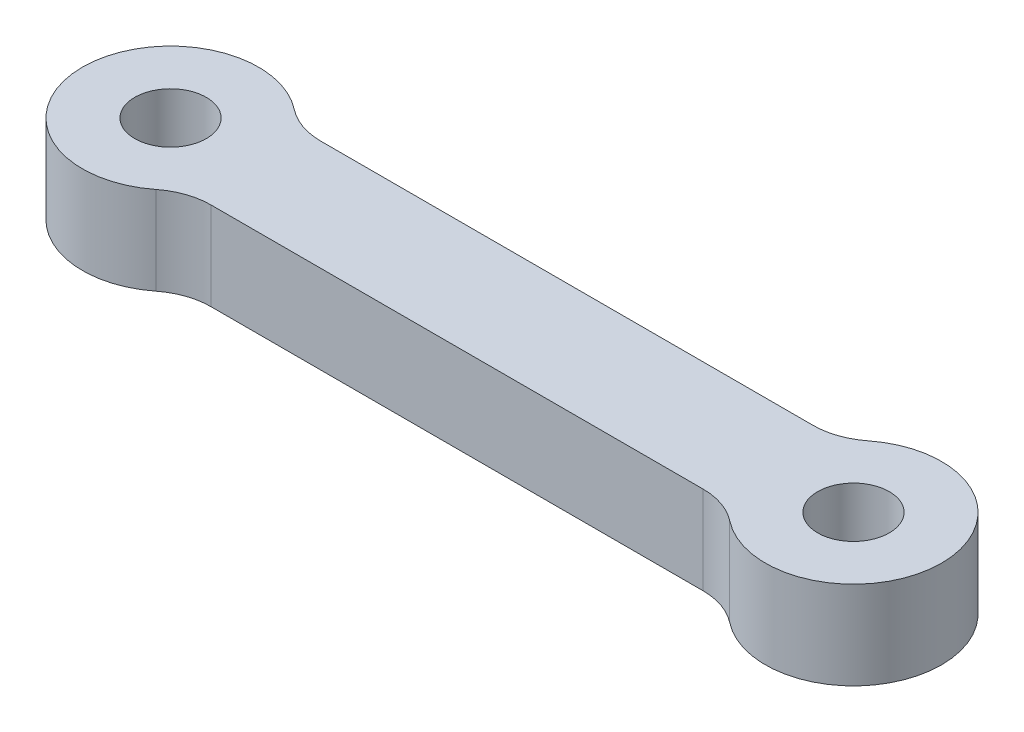
ISO-10303-21;
HEADER;
FILE_DESCRIPTION(('STEP AP214'),'2;1');
FILE_NAME('part.step','',(''),(''),'','','');
FILE_SCHEMA(('AUTOMOTIVE_DESIGN { 1 0 10303 214 1 1 1 1 }'));
ENDSEC;
DATA;
#1=APPLICATION_CONTEXT('core data for automotive mechanical design processes');
#2=APPLICATION_PROTOCOL_DEFINITION('international standard','automotive_design',2000,#1);
#3=PRODUCT_CONTEXT('',#1,'mechanical');
#4=PRODUCT('Part','Part','',(#3));
#5=PRODUCT_RELATED_PRODUCT_CATEGORY('part','',(#4));
#6=PRODUCT_DEFINITION_FORMATION('','',#4);
#7=PRODUCT_DEFINITION_CONTEXT('part definition',#1,'design');
#8=PRODUCT_DEFINITION('design','',#6,#7);
#9=PRODUCT_DEFINITION_SHAPE('','',#8);
#10=(LENGTH_UNIT() NAMED_UNIT(*) SI_UNIT(.MILLI.,.METRE.));
#11=(NAMED_UNIT(*) PLANE_ANGLE_UNIT() SI_UNIT($,.RADIAN.));
#12=(NAMED_UNIT(*) SI_UNIT($,.STERADIAN.) SOLID_ANGLE_UNIT());
#13=UNCERTAINTY_MEASURE_WITH_UNIT(LENGTH_MEASURE(1.E-05),#10,'distance_accuracy_value','');
#14=(GEOMETRIC_REPRESENTATION_CONTEXT(3) GLOBAL_UNCERTAINTY_ASSIGNED_CONTEXT((#13)) GLOBAL_UNIT_ASSIGNED_CONTEXT((#10,
#11,#12)) REPRESENTATION_CONTEXT('',''));
#15=CARTESIAN_POINT('',(0.,0.,0.));
#16=DIRECTION('',(0.,0.,1.));
#17=DIRECTION('',(1.,0.,0.));
#18=AXIS2_PLACEMENT_3D('',#15,#16,#17);
#19=CARTESIAN_POINT('',(31.,4.,0.));
#20=DIRECTION('',(0.,-1.,0.));
#21=DIRECTION('',(0.,0.,-1.));
#22=AXIS2_PLACEMENT_3D('',#19,#20,#21);
#23=CYLINDRICAL_SURFACE('',#22,4.00000000000001);
#24=CARTESIAN_POINT('',(31.,4.,0.));
#25=DIRECTION('',(0.,1.,0.));
#26=DIRECTION('',(0.,0.,1.));
#27=AXIS2_PLACEMENT_3D('',#24,#25,#26);
#28=CIRCLE('',#27,4.00000000000001);
#29=CARTESIAN_POINT('',(28.525641703473,4.,3.14285714285714));
#30=VERTEX_POINT('',#29);
#31=CARTESIAN_POINT('',(28.525641703473,4.,-3.14285714285714));
#32=VERTEX_POINT('',#31);
#33=EDGE_CURVE('E151',#30,#32,#28,.T.);
#34=ORIENTED_EDGE('',*,*,#33,.F.);
#35=DIRECTION('',(0.,-1.,0.));
#36=VECTOR('',#35,1.);
#37=CARTESIAN_POINT('',(28.525641703473,4.,3.14285714285714));
#38=LINE('',#37,#36);
#39=CARTESIAN_POINT('',(28.525641703473,0.,3.14285714285714));
#40=VERTEX_POINT('',#39);
#41=EDGE_CURVE('E159',#30,#40,#38,.T.);
#42=ORIENTED_EDGE('',*,*,#41,.T.);
#43=CARTESIAN_POINT('',(31.,0.,0.));
#44=DIRECTION('',(0.,1.,0.));
#45=DIRECTION('',(0.,0.,1.));
#46=AXIS2_PLACEMENT_3D('',#43,#44,#45);
#47=CIRCLE('',#46,4.00000000000001);
#48=CARTESIAN_POINT('',(28.525641703473,0.,-3.14285714285714));
#49=VERTEX_POINT('',#48);
#50=EDGE_CURVE('E176',#40,#49,#47,.T.);
#51=ORIENTED_EDGE('',*,*,#50,.T.);
#52=DIRECTION('',(0.,-1.,0.));
#53=VECTOR('',#52,1.);
#54=CARTESIAN_POINT('',(28.525641703473,4.,-3.14285714285714));
#55=LINE('',#54,#53);
#56=EDGE_CURVE('E157',#49,#32,#55,.F.);
#57=ORIENTED_EDGE('',*,*,#56,.T.);
#58=EDGE_LOOP('',(#34,#42,#51,#57));
#59=FACE_BOUND('',#58,.T.);
#60=ADVANCED_FACE('F45',(#59),#23,.T.);
#61=CARTESIAN_POINT('',(0.,4.,-2.5));
#62=DIRECTION('',(0.,0.,-1.));
#63=DIRECTION('',(-1.,0.,0.));
#64=AXIS2_PLACEMENT_3D('',#61,#62,#63);
#65=PLANE('',#64);
#66=DIRECTION('',(1.,0.,0.));
#67=VECTOR('',#66,1.);
#68=CARTESIAN_POINT('',(0.,4.,-2.5));
#69=LINE('',#68,#67);
#70=CARTESIAN_POINT('',(4.33012701892219,4.,-2.5));
#71=VERTEX_POINT('',#70);
#72=CARTESIAN_POINT('',(26.6698729810778,4.,-2.5));
#73=VERTEX_POINT('',#72);
#74=EDGE_CURVE('E183',#71,#73,#69,.T.);
#75=ORIENTED_EDGE('',*,*,#74,.T.);
#76=DIRECTION('',(0.,-1.,0.));
#77=VECTOR('',#76,1.);
#78=CARTESIAN_POINT('',(26.6698729810778,4.,-2.5));
#79=LINE('',#78,#77);
#80=CARTESIAN_POINT('',(26.6698729810778,0.,-2.5));
#81=VERTEX_POINT('',#80);
#82=EDGE_CURVE('E122',#73,#81,#79,.T.);
#83=ORIENTED_EDGE('',*,*,#82,.T.);
#84=DIRECTION('',(1.,0.,0.));
#85=VECTOR('',#84,1.);
#86=CARTESIAN_POINT('',(0.,0.,-2.5));
#87=LINE('',#86,#85);
#88=CARTESIAN_POINT('',(4.33012701892219,0.,-2.5));
#89=VERTEX_POINT('',#88);
#90=EDGE_CURVE('E145',#89,#81,#87,.T.);
#91=ORIENTED_EDGE('',*,*,#90,.F.);
#92=DIRECTION('',(0.,-1.,0.));
#93=VECTOR('',#92,1.);
#94=CARTESIAN_POINT('',(4.33012701892219,4.,-2.5));
#95=LINE('',#94,#93);
#96=EDGE_CURVE('E67',#89,#71,#95,.F.);
#97=ORIENTED_EDGE('',*,*,#96,.T.);
#98=EDGE_LOOP('',(#75,#83,#91,#97));
#99=FACE_BOUND('',#98,.T.);
#100=ADVANCED_FACE('F174',(#99),#65,.T.);
#101=CARTESIAN_POINT('',(0.,4.,0.));
#102=DIRECTION('',(0.,-1.,0.));
#103=DIRECTION('',(0.,0.,-1.));
#104=AXIS2_PLACEMENT_3D('',#101,#102,#103);
#105=CYLINDRICAL_SURFACE('',#104,4.);
#106=CARTESIAN_POINT('',(0.,0.,0.));
#107=DIRECTION('',(0.,1.,0.));
#108=DIRECTION('',(0.,0.,1.));
#109=AXIS2_PLACEMENT_3D('',#106,#107,#108);
#110=CIRCLE('',#109,4.);
#111=CARTESIAN_POINT('',(2.47435829652697,0.,-3.14285714285714));
#112=VERTEX_POINT('',#111);
#113=CARTESIAN_POINT('',(2.47435829652697,0.,3.14285714285714));
#114=VERTEX_POINT('',#113);
#115=EDGE_CURVE('E140',#112,#114,#110,.T.);
#116=ORIENTED_EDGE('',*,*,#115,.T.);
#117=DIRECTION('',(0.,-1.,0.));
#118=VECTOR('',#117,1.);
#119=CARTESIAN_POINT('',(2.47435829652697,4.,3.14285714285714));
#120=LINE('',#119,#118);
#121=CARTESIAN_POINT('',(2.47435829652697,4.,3.14285714285714));
#122=VERTEX_POINT('',#121);
#123=EDGE_CURVE('E116',#114,#122,#120,.F.);
#124=ORIENTED_EDGE('',*,*,#123,.T.);
#125=CARTESIAN_POINT('',(0.,4.,0.));
#126=DIRECTION('',(0.,1.,0.));
#127=DIRECTION('',(0.,0.,1.));
#128=AXIS2_PLACEMENT_3D('',#125,#126,#127);
#129=CIRCLE('',#128,4.);
#130=CARTESIAN_POINT('',(2.47435829652697,4.,-3.14285714285714));
#131=VERTEX_POINT('',#130);
#132=EDGE_CURVE('E182',#131,#122,#129,.T.);
#133=ORIENTED_EDGE('',*,*,#132,.F.);
#134=DIRECTION('',(0.,-1.,0.));
#135=VECTOR('',#134,1.);
#136=CARTESIAN_POINT('',(2.47435829652697,4.,-3.14285714285714));
#137=LINE('',#136,#135);
#138=EDGE_CURVE('E132',#131,#112,#137,.T.);
#139=ORIENTED_EDGE('',*,*,#138,.T.);
#140=EDGE_LOOP('',(#116,#124,#133,#139));
#141=FACE_BOUND('',#140,.T.);
#142=ADVANCED_FACE('F185',(#141),#105,.T.);
#143=CARTESIAN_POINT('',(0.,4.,0.));
#144=DIRECTION('',(0.,-1.,0.));
#145=DIRECTION('',(0.,0.,-1.));
#146=AXIS2_PLACEMENT_3D('',#143,#144,#145);
#147=CYLINDRICAL_SURFACE('',#146,1.625);
#148=CARTESIAN_POINT('',(0.,4.,0.));
#149=DIRECTION('',(0.,1.,0.));
#150=DIRECTION('',(0.,0.,1.));
#151=AXIS2_PLACEMENT_3D('',#148,#149,#150);
#152=CIRCLE('',#151,1.625);
#153=CARTESIAN_POINT('',(0.,4.,1.625));
#154=VERTEX_POINT('',#153);
#155=EDGE_CURVE('E187',#154,#154,#152,.T.);
#156=ORIENTED_EDGE('',*,*,#155,.T.);
#157=EDGE_LOOP('',(#156));
#158=FACE_BOUND('',#157,.T.);
#159=CARTESIAN_POINT('',(0.,0.,0.));
#160=DIRECTION('',(0.,1.,0.));
#161=DIRECTION('',(0.,0.,1.));
#162=AXIS2_PLACEMENT_3D('',#159,#160,#161);
#163=CIRCLE('',#162,1.625);
#164=CARTESIAN_POINT('',(0.,0.,1.625));
#165=VERTEX_POINT('',#164);
#166=EDGE_CURVE('E139',#165,#165,#163,.T.);
#167=ORIENTED_EDGE('',*,*,#166,.F.);
#168=EDGE_LOOP('',(#167));
#169=FACE_BOUND('',#168,.T.);
#170=ADVANCED_FACE('F233',(#158,#169),#147,.F.);
#171=CARTESIAN_POINT('',(0.,4.,2.5));
#172=DIRECTION('',(0.,0.,-1.));
#173=DIRECTION('',(-1.,0.,0.));
#174=AXIS2_PLACEMENT_3D('',#171,#172,#173);
#175=PLANE('',#174);
#176=DIRECTION('',(1.,0.,0.));
#177=VECTOR('',#176,1.);
#178=CARTESIAN_POINT('',(0.,4.,2.5));
#179=LINE('',#178,#177);
#180=CARTESIAN_POINT('',(4.3301270189222,4.,2.5));
#181=VERTEX_POINT('',#180);
#182=CARTESIAN_POINT('',(26.6698729810778,4.,2.5));
#183=VERTEX_POINT('',#182);
#184=EDGE_CURVE('E131',#181,#183,#179,.T.);
#185=ORIENTED_EDGE('',*,*,#184,.F.);
#186=DIRECTION('',(0.,1.,0.));
#187=VECTOR('',#186,1.);
#188=CARTESIAN_POINT('',(4.3301270189222,0.,2.5));
#189=LINE('',#188,#187);
#190=CARTESIAN_POINT('',(4.3301270189222,0.,2.5));
#191=VERTEX_POINT('',#190);
#192=EDGE_CURVE('E115',#181,#191,#189,.F.);
#193=ORIENTED_EDGE('',*,*,#192,.T.);
#194=DIRECTION('',(1.,0.,0.));
#195=VECTOR('',#194,1.);
#196=CARTESIAN_POINT('',(0.,0.,2.5));
#197=LINE('',#196,#195);
#198=CARTESIAN_POINT('',(26.6698729810778,0.,2.5));
#199=VERTEX_POINT('',#198);
#200=EDGE_CURVE('E128',#191,#199,#197,.T.);
#201=ORIENTED_EDGE('',*,*,#200,.T.);
#202=DIRECTION('',(0.,1.,0.));
#203=VECTOR('',#202,1.);
#204=CARTESIAN_POINT('',(26.6698729810778,4.,2.5));
#205=LINE('',#204,#203);
#206=EDGE_CURVE('E133',#199,#183,#205,.T.);
#207=ORIENTED_EDGE('',*,*,#206,.T.);
#208=EDGE_LOOP('',(#185,#193,#201,#207));
#209=FACE_BOUND('',#208,.T.);
#210=ADVANCED_FACE('F127',(#209),#175,.F.);
#211=CARTESIAN_POINT('',(31.,4.,0.));
#212=DIRECTION('',(0.,-1.,0.));
#213=DIRECTION('',(0.,0.,-1.));
#214=AXIS2_PLACEMENT_3D('',#211,#212,#213);
#215=CYLINDRICAL_SURFACE('',#214,1.625);
#216=CARTESIAN_POINT('',(31.,4.,0.));
#217=DIRECTION('',(0.,1.,0.));
#218=DIRECTION('',(0.,0.,1.));
#219=AXIS2_PLACEMENT_3D('',#216,#217,#218);
#220=CIRCLE('',#219,1.625);
#221=CARTESIAN_POINT('',(31.,4.,1.625));
#222=VERTEX_POINT('',#221);
#223=EDGE_CURVE('E152',#222,#222,#220,.T.);
#224=ORIENTED_EDGE('',*,*,#223,.T.);
#225=EDGE_LOOP('',(#224));
#226=FACE_BOUND('',#225,.T.);
#227=CARTESIAN_POINT('',(31.,0.,0.));
#228=DIRECTION('',(0.,1.,0.));
#229=DIRECTION('',(0.,0.,1.));
#230=AXIS2_PLACEMENT_3D('',#227,#228,#229);
#231=CIRCLE('',#230,1.625);
#232=CARTESIAN_POINT('',(31.,0.,1.625));
#233=VERTEX_POINT('',#232);
#234=EDGE_CURVE('E143',#233,#233,#231,.T.);
#235=ORIENTED_EDGE('',*,*,#234,.F.);
#236=EDGE_LOOP('',(#235));
#237=FACE_BOUND('',#236,.T.);
#238=ADVANCED_FACE('F228',(#226,#237),#215,.F.);
#239=CARTESIAN_POINT('',(0.,4.,0.));
#240=DIRECTION('',(0.,1.,0.));
#241=DIRECTION('',(0.,0.,1.));
#242=AXIS2_PLACEMENT_3D('',#239,#240,#241);
#243=PLANE('',#242);
#244=ORIENTED_EDGE('',*,*,#184,.T.);
#245=CARTESIAN_POINT('',(26.6698729810778,4.,5.5));
#246=DIRECTION('',(0.,1.,0.));
#247=DIRECTION('',(0.,0.,1.));
#248=AXIS2_PLACEMENT_3D('',#245,#246,#247);
#249=CIRCLE('',#248,3.);
#250=EDGE_CURVE('E167',#183,#30,#249,.F.);
#251=ORIENTED_EDGE('',*,*,#250,.T.);
#252=ORIENTED_EDGE('',*,*,#33,.T.);
#253=CARTESIAN_POINT('',(26.6698729810778,4.,-5.5));
#254=DIRECTION('',(0.,1.,0.));
#255=DIRECTION('',(0.,0.,1.));
#256=AXIS2_PLACEMENT_3D('',#253,#254,#255);
#257=CIRCLE('',#256,3.);
#258=EDGE_CURVE('E60',#32,#73,#257,.F.);
#259=ORIENTED_EDGE('',*,*,#258,.T.);
#260=ORIENTED_EDGE('',*,*,#74,.F.);
#261=CARTESIAN_POINT('',(4.33012701892219,4.,-5.5));
#262=DIRECTION('',(0.,1.,0.));
#263=DIRECTION('',(0.,0.,1.));
#264=AXIS2_PLACEMENT_3D('',#261,#262,#263);
#265=CIRCLE('',#264,3.);
#266=EDGE_CURVE('E11',#71,#131,#265,.F.);
#267=ORIENTED_EDGE('',*,*,#266,.T.);
#268=ORIENTED_EDGE('',*,*,#132,.T.);
#269=CARTESIAN_POINT('',(4.3301270189222,4.,5.5));
#270=DIRECTION('',(0.,1.,0.));
#271=DIRECTION('',(0.,0.,1.));
#272=AXIS2_PLACEMENT_3D('',#269,#270,#271);
#273=CIRCLE('',#272,3.);
#274=EDGE_CURVE('E121',#122,#181,#273,.F.);
#275=ORIENTED_EDGE('',*,*,#274,.T.);
#276=EDGE_LOOP('',(#244,#251,#252,#259,#260,#267,#268,#275));
#277=FACE_BOUND('',#276,.T.);
#278=ORIENTED_EDGE('',*,*,#155,.F.);
#279=EDGE_LOOP('',(#278));
#280=FACE_BOUND('',#279,.T.);
#281=ORIENTED_EDGE('',*,*,#223,.F.);
#282=EDGE_LOOP('',(#281));
#283=FACE_BOUND('',#282,.T.);
#284=ADVANCED_FACE('F180',(#277,#280,#283),#243,.T.);
#285=CARTESIAN_POINT('',(0.,0.,0.));
#286=DIRECTION('',(0.,1.,0.));
#287=DIRECTION('',(0.,0.,1.));
#288=AXIS2_PLACEMENT_3D('',#285,#286,#287);
#289=PLANE('',#288);
#290=ORIENTED_EDGE('',*,*,#50,.F.);
#291=CARTESIAN_POINT('',(26.6698729810778,0.,5.5));
#292=DIRECTION('',(0.,1.,0.));
#293=DIRECTION('',(0.,0.,1.));
#294=AXIS2_PLACEMENT_3D('',#291,#292,#293);
#295=CIRCLE('',#294,3.);
#296=EDGE_CURVE('E138',#40,#199,#295,.T.);
#297=ORIENTED_EDGE('',*,*,#296,.T.);
#298=ORIENTED_EDGE('',*,*,#200,.F.);
#299=CARTESIAN_POINT('',(4.3301270189222,0.,5.5));
#300=DIRECTION('',(0.,1.,0.));
#301=DIRECTION('',(0.,0.,1.));
#302=AXIS2_PLACEMENT_3D('',#299,#300,#301);
#303=CIRCLE('',#302,3.);
#304=EDGE_CURVE('E111',#191,#114,#303,.T.);
#305=ORIENTED_EDGE('',*,*,#304,.T.);
#306=ORIENTED_EDGE('',*,*,#115,.F.);
#307=CARTESIAN_POINT('',(4.33012701892219,0.,-5.5));
#308=DIRECTION('',(0.,1.,0.));
#309=DIRECTION('',(0.,0.,1.));
#310=AXIS2_PLACEMENT_3D('',#307,#308,#309);
#311=CIRCLE('',#310,3.);
#312=EDGE_CURVE('E53',#112,#89,#311,.T.);
#313=ORIENTED_EDGE('',*,*,#312,.T.);
#314=ORIENTED_EDGE('',*,*,#90,.T.);
#315=CARTESIAN_POINT('',(26.6698729810778,0.,-5.5));
#316=DIRECTION('',(0.,1.,0.));
#317=DIRECTION('',(0.,0.,1.));
#318=AXIS2_PLACEMENT_3D('',#315,#316,#317);
#319=CIRCLE('',#318,3.);
#320=EDGE_CURVE('E169',#81,#49,#319,.T.);
#321=ORIENTED_EDGE('',*,*,#320,.T.);
#322=EDGE_LOOP('',(#290,#297,#298,#305,#306,#313,#314,#321));
#323=FACE_BOUND('',#322,.T.);
#324=ORIENTED_EDGE('',*,*,#166,.T.);
#325=EDGE_LOOP('',(#324));
#326=FACE_BOUND('',#325,.T.);
#327=ORIENTED_EDGE('',*,*,#234,.T.);
#328=EDGE_LOOP('',(#327));
#329=FACE_BOUND('',#328,.T.);
#330=ADVANCED_FACE('F136',(#323,#326,#329),#289,.F.);
#331=CARTESIAN_POINT('',(4.3301270189222,4.,5.5));
#332=DIRECTION('',(0.,-1.,0.));
#333=DIRECTION('',(0.,0.,-1.));
#334=AXIS2_PLACEMENT_3D('',#331,#332,#333);
#335=CYLINDRICAL_SURFACE('',#334,3.);
#336=ORIENTED_EDGE('',*,*,#274,.F.);
#337=ORIENTED_EDGE('',*,*,#123,.F.);
#338=ORIENTED_EDGE('',*,*,#304,.F.);
#339=ORIENTED_EDGE('',*,*,#192,.F.);
#340=EDGE_LOOP('',(#336,#337,#338,#339));
#341=FACE_BOUND('',#340,.T.);
#342=ADVANCED_FACE('F114',(#341),#335,.F.);
#343=CARTESIAN_POINT('',(26.6698729810778,4.,5.5));
#344=DIRECTION('',(0.,-1.,0.));
#345=DIRECTION('',(0.,0.,-1.));
#346=AXIS2_PLACEMENT_3D('',#343,#344,#345);
#347=CYLINDRICAL_SURFACE('',#346,3.);
#348=ORIENTED_EDGE('',*,*,#250,.F.);
#349=ORIENTED_EDGE('',*,*,#206,.F.);
#350=ORIENTED_EDGE('',*,*,#296,.F.);
#351=ORIENTED_EDGE('',*,*,#41,.F.);
#352=EDGE_LOOP('',(#348,#349,#350,#351));
#353=FACE_BOUND('',#352,.T.);
#354=ADVANCED_FACE('F204',(#353),#347,.F.);
#355=CARTESIAN_POINT('',(26.6698729810778,4.,-5.5));
#356=DIRECTION('',(0.,-1.,0.));
#357=DIRECTION('',(0.,0.,-1.));
#358=AXIS2_PLACEMENT_3D('',#355,#356,#357);
#359=CYLINDRICAL_SURFACE('',#358,3.);
#360=ORIENTED_EDGE('',*,*,#258,.F.);
#361=ORIENTED_EDGE('',*,*,#56,.F.);
#362=ORIENTED_EDGE('',*,*,#320,.F.);
#363=ORIENTED_EDGE('',*,*,#82,.F.);
#364=EDGE_LOOP('',(#360,#361,#362,#363));
#365=FACE_BOUND('',#364,.T.);
#366=ADVANCED_FACE('F202',(#365),#359,.F.);
#367=CARTESIAN_POINT('',(4.33012701892219,4.,-5.5));
#368=DIRECTION('',(0.,-1.,0.));
#369=DIRECTION('',(0.,0.,-1.));
#370=AXIS2_PLACEMENT_3D('',#367,#368,#369);
#371=CYLINDRICAL_SURFACE('',#370,3.);
#372=ORIENTED_EDGE('',*,*,#266,.F.);
#373=ORIENTED_EDGE('',*,*,#96,.F.);
#374=ORIENTED_EDGE('',*,*,#312,.F.);
#375=ORIENTED_EDGE('',*,*,#138,.F.);
#376=EDGE_LOOP('',(#372,#373,#374,#375));
#377=FACE_BOUND('',#376,.T.);
#378=ADVANCED_FACE('F47',(#377),#371,.F.);
#379=CLOSED_SHELL('',(#60,#100,#142,#170,#210,#238,#284,#330,#342,#354,#366,#378));
#380=MANIFOLD_SOLID_BREP('B2',#379);
#381=ADVANCED_BREP_SHAPE_REPRESENTATION('',(#18,#380),#14);
#382=SHAPE_DEFINITION_REPRESENTATION(#9,#381);
ENDSEC;
END-ISO-10303-21;
